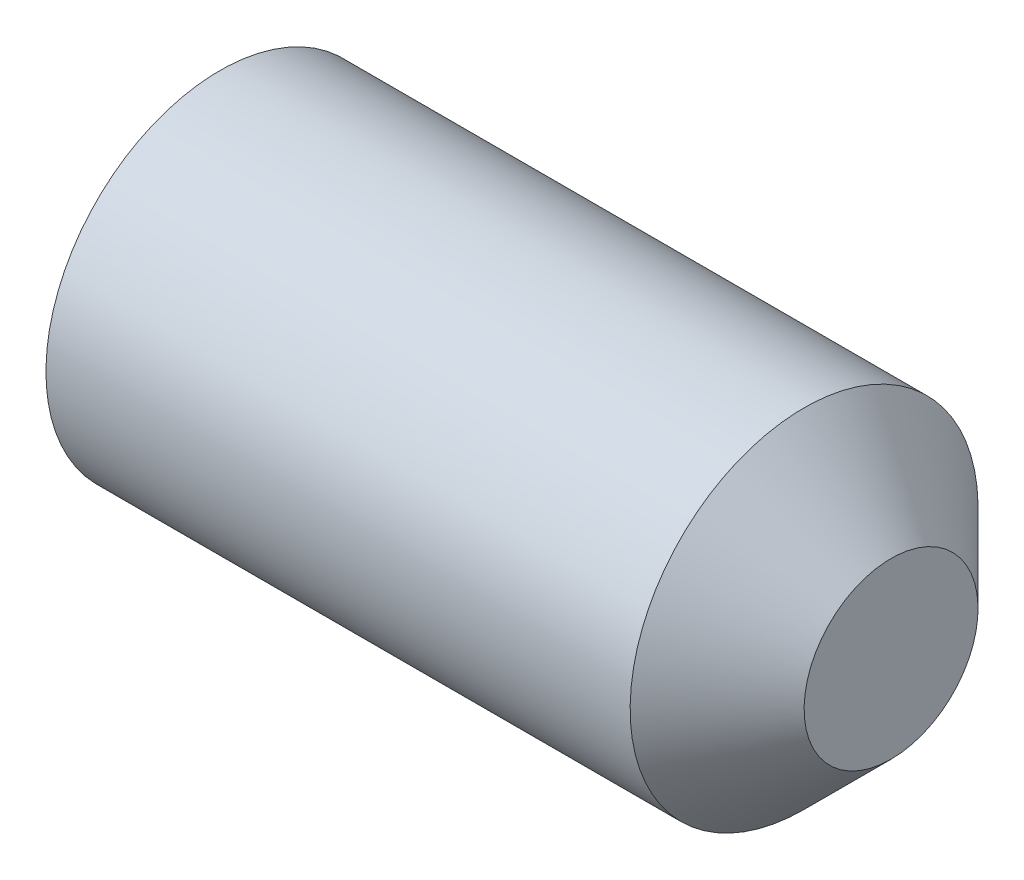
ISO-10303-21;
HEADER;
FILE_DESCRIPTION(('STEP AP214'),'2;1');
FILE_NAME('part.step','',(''),(''),'','','');
FILE_SCHEMA(('AUTOMOTIVE_DESIGN { 1 0 10303 214 1 1 1 1 }'));
ENDSEC;
DATA;
#1=APPLICATION_CONTEXT('core data for automotive mechanical design processes');
#2=APPLICATION_PROTOCOL_DEFINITION('international standard','automotive_design',2000,#1);
#3=PRODUCT_CONTEXT('',#1,'mechanical');
#4=PRODUCT('Part','Part','',(#3));
#5=PRODUCT_RELATED_PRODUCT_CATEGORY('part','',(#4));
#6=PRODUCT_DEFINITION_FORMATION('','',#4);
#7=PRODUCT_DEFINITION_CONTEXT('part definition',#1,'design');
#8=PRODUCT_DEFINITION('design','',#6,#7);
#9=PRODUCT_DEFINITION_SHAPE('','',#8);
#10=(LENGTH_UNIT() NAMED_UNIT(*) SI_UNIT(.MILLI.,.METRE.));
#11=(NAMED_UNIT(*) PLANE_ANGLE_UNIT() SI_UNIT($,.RADIAN.));
#12=(NAMED_UNIT(*) SI_UNIT($,.STERADIAN.) SOLID_ANGLE_UNIT());
#13=UNCERTAINTY_MEASURE_WITH_UNIT(LENGTH_MEASURE(1.E-05),#10,'distance_accuracy_value','');
#14=(GEOMETRIC_REPRESENTATION_CONTEXT(3) GLOBAL_UNCERTAINTY_ASSIGNED_CONTEXT((#13)) GLOBAL_UNIT_ASSIGNED_CONTEXT((#10,
#11,#12)) REPRESENTATION_CONTEXT('',''));
#15=CARTESIAN_POINT('',(0.,0.,0.));
#16=DIRECTION('',(0.,0.,1.));
#17=DIRECTION('',(1.,0.,0.));
#18=AXIS2_PLACEMENT_3D('',#15,#16,#17);
#19=CARTESIAN_POINT('',(0.3,0.,0.));
#20=DIRECTION('',(-1.,0.,0.));
#21=DIRECTION('',(0.,-1.,0.));
#22=AXIS2_PLACEMENT_3D('',#19,#20,#21);
#23=CONICAL_SURFACE('',#22,0.,1.04719755119659);
#24=CARTESIAN_POINT('',(0.,0.,0.));
#25=DIRECTION('',(-1.,0.,0.));
#26=DIRECTION('',(0.,-1.,0.));
#27=AXIS2_PLACEMENT_3D('',#24,#25,#26);
#28=CIRCLE('',#27,0.51961524227066);
#29=CARTESIAN_POINT('',(0.,0.,0.51961524227066));
#30=VERTEX_POINT('',#29);
#31=CARTESIAN_POINT('',(0.,0.45,0.259807621135324));
#32=VERTEX_POINT('',#31);
#33=EDGE_CURVE('E135',#30,#32,#28,.T.);
#34=ORIENTED_EDGE('',*,*,#33,.T.);
#35=CARTESIAN_POINT('',(-6.66888839525152E-05,0.4502,0.259692151081492));
#36=CARTESIAN_POINT('',(0.00653172705960724,0.430421483954661,0.27111128264444));
#37=CARTESIAN_POINT('',(0.0125342691634511,0.410472798158753,0.282628661758686));
#38=CARTESIAN_POINT('',(0.0230135187971852,0.370229751521738,0.305862995567578));
#39=CARTESIAN_POINT('',(0.027486516452898,0.349934673828958,0.317580364136728));
#40=CARTESIAN_POINT('',(0.034450129571118,0.309595036889726,0.340870464382606));
#41=CARTESIAN_POINT('',(0.036987101516643,0.289556723246236,0.352439590158781));
#42=CARTESIAN_POINT('',(0.040025127002509,0.249389705984048,0.375630028387649));
#43=CARTESIAN_POINT('',(0.0405286808946072,0.229261143861694,0.38725125914739));
#44=CARTESIAN_POINT('',(0.0390166754817044,0.174083098641577,0.419108318408582));
#45=CARTESIAN_POINT('',(0.0348502997742021,0.139064505017148,0.439326312864288));
#46=CARTESIAN_POINT('',(0.0245754670606726,0.0867922566681631,0.469505709519721));
#47=CARTESIAN_POINT('',(0.0204087890255679,0.069213824417743,0.479654622111433));
#48=CARTESIAN_POINT('',(0.0109518938247607,0.0343196791997078,0.499800766246207));
#49=CARTESIAN_POINT('',(0.00566390792624987,0.0170035166025984,0.50979825738298));
#50=CARTESIAN_POINT('',(-6.66888839509336E-05,-0.000200000000000022,0.519730712324498));
#51=B_SPLINE_CURVE_WITH_KNOTS('',3,(#35,#36,#37,#38,#39,#40,#41,#42,#43,#44,#45,#46,#47,#48,#49,
#50),.UNSPECIFIED.,.F.,.F.,(4,2,2,2,2,2,2,4),(0.,0.0713444195912559,0.142860675962759,
0.212605584457696,0.282264706361124,0.403704621565636,0.465844557315113,0.527861983379931),.UNSPECIFIED.);
#52=EDGE_CURVE('E11',#32,#30,#51,.T.);
#53=ORIENTED_EDGE('',*,*,#52,.T.);
#54=EDGE_LOOP('',(#34,#53));
#55=FACE_BOUND('',#54,.T.);
#56=ADVANCED_FACE('F33',(#55),#23,.F.);
#57=CARTESIAN_POINT('',(0.,-0.45,0.25980762113533));
#58=VERTEX_POINT('',#57);
#59=EDGE_CURVE('E131',#58,#30,#28,.T.);
#60=ORIENTED_EDGE('',*,*,#59,.T.);
#61=CARTESIAN_POINT('',(-6.66888839509963E-05,0.000199999999999954,0.519730712324498));
#62=CARTESIAN_POINT('',(0.00653172705960863,-0.0195785160453388,0.50831158076155));
#63=CARTESIAN_POINT('',(0.0125342691634524,-0.0395272018412467,0.496794201647304));
#64=CARTESIAN_POINT('',(0.0230135187971862,-0.0797702484782621,0.473559867838412));
#65=CARTESIAN_POINT('',(0.0274865164528988,-0.100065326171041,0.461842499269262));
#66=CARTESIAN_POINT('',(0.0344501295711185,-0.140404963110274,0.438552399023384));
#67=CARTESIAN_POINT('',(0.0369871015166435,-0.160443276753764,0.426983273247209));
#68=CARTESIAN_POINT('',(0.0400251270025092,-0.200610294015951,0.403792835018341));
#69=CARTESIAN_POINT('',(0.0405286808946073,-0.220738856138306,0.3921716042586));
#70=CARTESIAN_POINT('',(0.0390166754817042,-0.275916901358422,0.360314544997408));
#71=CARTESIAN_POINT('',(0.0348502997742015,-0.310935494982852,0.340096550541702));
#72=CARTESIAN_POINT('',(0.0245754670606718,-0.363207743331836,0.309917153886269));
#73=CARTESIAN_POINT('',(0.0204087890255671,-0.380786175582257,0.299768241294557));
#74=CARTESIAN_POINT('',(0.0109518938247597,-0.415680320800292,0.279622097159783));
#75=CARTESIAN_POINT('',(0.00566390792624876,-0.432996483397401,0.26962460602301));
#76=CARTESIAN_POINT('',(-6.66888839522213E-05,-0.4502,0.259692151081492));
#77=B_SPLINE_CURVE_WITH_KNOTS('',3,(#61,#62,#63,#64,#65,#66,#67,#68,#69,#70,#71,#72,#73,#74,#75,
#76),.UNSPECIFIED.,.F.,.F.,(4,2,2,2,2,2,2,4),(0.,0.0713444195912556,0.142860675962758,
0.212605584457695,0.282264706361123,0.403704621565635,0.465844557315112,0.527861983379931),.UNSPECIFIED.);
#78=EDGE_CURVE('E46',#30,#58,#77,.T.);
#79=ORIENTED_EDGE('',*,*,#78,.T.);
#80=EDGE_LOOP('',(#60,#79));
#81=FACE_BOUND('',#80,.T.);
#82=ADVANCED_FACE('F201',(#81),#23,.F.);
#83=CARTESIAN_POINT('',(0.,-0.45,-0.25980762113533));
#84=VERTEX_POINT('',#83);
#85=EDGE_CURVE('E130',#84,#58,#28,.T.);
#86=ORIENTED_EDGE('',*,*,#85,.T.);
#87=CARTESIAN_POINT('',(-0.167325879932759,-0.45,-0.672815304645171));
#88=CARTESIAN_POINT('',(-0.158001759178348,-0.45,-0.653382567146488));
#89=CARTESIAN_POINT('',(-0.148776152203629,-0.45,-0.633902770072334));
#90=CARTESIAN_POINT('',(-0.130573544393024,-0.45,-0.594823264113635));
#91=CARTESIAN_POINT('',(-0.121596588297758,-0.45,-0.5752235344139));
#92=CARTESIAN_POINT('',(-0.0950153183469655,-0.45,-0.515980526481325));
#93=CARTESIAN_POINT('',(-0.0778736353237743,-0.45,-0.47612575486808));
#94=CARTESIAN_POINT('',(-0.0451106178559764,-0.45,-0.3945748475684));
#95=CARTESIAN_POINT('',(-0.0295406271142098,-0.45,-0.352857800316648));
#96=CARTESIAN_POINT('',(-0.00183306277081833,-0.45,-0.268349284360111));
#97=CARTESIAN_POINT('',(0.0103134219915786,-0.45,-0.225560926692814));
#98=CARTESIAN_POINT('',(0.0244009034813655,-0.45,-0.160514993917704));
#99=CARTESIAN_POINT('',(0.028406205648938,-0.45,-0.138709873455419));
#100=CARTESIAN_POINT('',(0.0347659057008732,-0.45,-0.0948549918774094));
#101=CARTESIAN_POINT('',(0.0371204151496414,-0.45,-0.0728052473962739));
#102=CARTESIAN_POINT('',(0.039960458555727,-0.45,-0.0288477221469544));
#103=CARTESIAN_POINT('',(0.0404680477479484,-0.45,-0.00694140584462085));
#104=CARTESIAN_POINT('',(0.0396301597624702,-0.45,0.0368349103264743));
#105=CARTESIAN_POINT('',(0.0382845678406222,-0.45,0.0587049078625245));
#106=CARTESIAN_POINT('',(0.0327967553536856,-0.45,0.112666314227676));
#107=CARTESIAN_POINT('',(0.027626148000219,-0.45,0.144653361443957));
#108=CARTESIAN_POINT('',(0.0142918581073101,-0.45,0.208003062927822));
#109=CARTESIAN_POINT('',(0.00612456819211948,-0.45,0.239364916419214));
#110=CARTESIAN_POINT('',(-0.0125413731327451,-0.45,0.302137073282898));
#111=CARTESIAN_POINT('',(-0.0230882230070336,-0.45,0.333532674691125));
#112=CARTESIAN_POINT('',(-0.0457040201416149,-0.45,0.395747240948126));
#113=CARTESIAN_POINT('',(-0.0577724331004678,-0.45,0.426566403873595));
#114=CARTESIAN_POINT('',(-0.090024526173721,-0.45,0.504965985572437));
#115=CARTESIAN_POINT('',(-0.110958081103708,-0.45,0.552234907386845));
#116=CARTESIAN_POINT('',(-0.154295866522787,-0.45,0.646094421082346));
#117=CARTESIAN_POINT('',(-0.176700474276702,-0.45,0.692684835181449));
#118=CARTESIAN_POINT('',(-0.222453425540136,-0.45,0.785464529819758));
#119=CARTESIAN_POINT('',(-0.24580282094626,-0.45,0.831653289585937));
#120=CARTESIAN_POINT('',(-0.293105854507297,-0.45,0.923721004656836));
#121=CARTESIAN_POINT('',(-0.317059517094918,-0.45,0.969599947339142));
#122=CARTESIAN_POINT('',(-0.38496905023855,-0.45,1.09826702015621));
#123=CARTESIAN_POINT('',(-0.429390030359738,-0.45,1.1808092680611));
#124=CARTESIAN_POINT('',(-0.496513992041545,-0.45,1.30421778525283));
#125=CARTESIAN_POINT('',(-0.518942048017681,-0.45,1.34523485292903));
#126=CARTESIAN_POINT('',(-0.563944137236346,-0.45,1.42718606343186));
#127=CARTESIAN_POINT('',(-0.586518162777899,-0.45,1.46812021048593));
#128=CARTESIAN_POINT('',(-0.609148310462413,-0.45,1.50902350917736));
#129=B_SPLINE_CURVE_WITH_KNOTS('',3,(#87,#88,#89,#90,#91,#92,#93,#94,#95,#96,#97,#98,#99,#100,
#101,#102,#103,#104,#105,#106,#107,#108,#109,#110,#111,#112,#113,#114,#115,#116,#117,#118,#119,
#120,#121,#122,#123,#124,#125,#126,#127,#128),.UNSPECIFIED.,.F.,.F.,(4,2,2,2,2,2,2,2,2,2,2,2,2,
2,2,2,2,2,2,2,4),(0.,0.0646606550585354,0.129332870134679,0.259452154750926,0.392966772480849,
0.526130581502781,0.592588524703461,0.659041976088961,0.724699211420468,0.790360512259777,
0.887366396654076,0.984489440925591,1.08379169798611,1.18305918137843,1.33809985745054,
1.49318045160005,1.64843873331219,1.80370330277247,2.08490270829397,2.22514805598809,
2.36538606410607),.UNSPECIFIED.);
#130=EDGE_CURVE('E177',#58,#84,#129,.F.);
#131=ORIENTED_EDGE('',*,*,#130,.T.);
#132=EDGE_LOOP('',(#86,#131));
#133=FACE_BOUND('',#132,.T.);
#134=ADVANCED_FACE('F207',(#133),#23,.F.);
#135=CARTESIAN_POINT('',(0.,0.,-0.51961524227066));
#136=VERTEX_POINT('',#135);
#137=EDGE_CURVE('E229',#136,#84,#28,.T.);
#138=ORIENTED_EDGE('',*,*,#137,.T.);
#139=CARTESIAN_POINT('',(-6.66888839523028E-05,-0.4502,-0.259692151081492));
#140=CARTESIAN_POINT('',(0.00653172705960735,-0.430421483954661,-0.27111128264444));
#141=CARTESIAN_POINT('',(0.0125342691634512,-0.410472798158753,-0.282628661758686));
#142=CARTESIAN_POINT('',(0.0230135187971853,-0.370229751521738,-0.305862995567578));
#143=CARTESIAN_POINT('',(0.0274865164528981,-0.349934673828958,-0.317580364136728));
#144=CARTESIAN_POINT('',(0.0344501295711181,-0.309595036889726,-0.340870464382606));
#145=CARTESIAN_POINT('',(0.0369871015166431,-0.289556723246236,-0.352439590158781));
#146=CARTESIAN_POINT('',(0.0400251270025091,-0.249389705984048,-0.375630028387649));
#147=CARTESIAN_POINT('',(0.0405286808946073,-0.229261143861694,-0.38725125914739));
#148=CARTESIAN_POINT('',(0.0390166754817045,-0.174083098641577,-0.419108318408582));
#149=CARTESIAN_POINT('',(0.0348502997742021,-0.139064505017148,-0.439326312864288));
#150=CARTESIAN_POINT('',(0.0245754670606726,-0.0867922566681631,-0.469505709519721));
#151=CARTESIAN_POINT('',(0.0204087890255679,-0.069213824417743,-0.479654622111433));
#152=CARTESIAN_POINT('',(0.0109518938247607,-0.0343196791997078,-0.499800766246207));
#153=CARTESIAN_POINT('',(0.00566390792624982,-0.0170035166025983,-0.50979825738298));
#154=CARTESIAN_POINT('',(-6.66888839509676E-05,0.000200000000000026,-0.519730712324498));
#155=B_SPLINE_CURVE_WITH_KNOTS('',3,(#139,#140,#141,#142,#143,#144,#145,#146,#147,#148,#149,
#150,#151,#152,#153,#154),.UNSPECIFIED.,.F.,.F.,(4,2,2,2,2,2,2,4),(0.,0.0713444195912559,
0.142860675962759,0.212605584457696,0.282264706361124,0.403704621565636,0.465844557315113,
0.527861983379931),.UNSPECIFIED.);
#156=EDGE_CURVE('E172',#84,#136,#155,.T.);
#157=ORIENTED_EDGE('',*,*,#156,.T.);
#158=EDGE_LOOP('',(#138,#157));
#159=FACE_BOUND('',#158,.T.);
#160=ADVANCED_FACE('F219',(#159),#23,.F.);
#161=CARTESIAN_POINT('',(0.,0.45,-0.25980762113533));
#162=VERTEX_POINT('',#161);
#163=EDGE_CURVE('E227',#162,#136,#28,.T.);
#164=ORIENTED_EDGE('',*,*,#163,.T.);
#165=CARTESIAN_POINT('',(-6.66888839509963E-05,-0.000199999999999954,-0.519730712324498));
#166=CARTESIAN_POINT('',(0.00653172705960863,0.0195785160453388,-0.50831158076155));
#167=CARTESIAN_POINT('',(0.0125342691634524,0.0395272018412467,-0.496794201647304));
#168=CARTESIAN_POINT('',(0.0230135187971861,0.0797702484782621,-0.473559867838412));
#169=CARTESIAN_POINT('',(0.0274865164528987,0.100065326171041,-0.461842499269262));
#170=CARTESIAN_POINT('',(0.0344501295711185,0.140404963110274,-0.438552399023384));
#171=CARTESIAN_POINT('',(0.0369871015166435,0.160443276753764,-0.426983273247209));
#172=CARTESIAN_POINT('',(0.0400251270025092,0.200610294015951,-0.403792835018341));
#173=CARTESIAN_POINT('',(0.0405286808946072,0.220738856138306,-0.3921716042586));
#174=CARTESIAN_POINT('',(0.0390166754817041,0.275916901358422,-0.360314544997408));
#175=CARTESIAN_POINT('',(0.0348502997742015,0.310935494982852,-0.340096550541702));
#176=CARTESIAN_POINT('',(0.0245754670606717,0.363207743331837,-0.309917153886269));
#177=CARTESIAN_POINT('',(0.0204087890255669,0.380786175582257,-0.299768241294557));
#178=CARTESIAN_POINT('',(0.0109518938247594,0.415680320800292,-0.279622097159783));
#179=CARTESIAN_POINT('',(0.00566390792624846,0.432996483397402,-0.26962460602301));
#180=CARTESIAN_POINT('',(-6.66888839525342E-05,0.4502,-0.259692151081492));
#181=B_SPLINE_CURVE_WITH_KNOTS('',3,(#165,#166,#167,#168,#169,#170,#171,#172,#173,#174,#175,
#176,#177,#178,#179,#180),.UNSPECIFIED.,.F.,.F.,(4,2,2,2,2,2,2,4),(0.,0.0713444195912556,
0.142860675962758,0.212605584457695,0.282264706361123,0.403704621565635,0.465844557315112,
0.527861983379931),.UNSPECIFIED.);
#182=EDGE_CURVE('E113',#136,#162,#181,.T.);
#183=ORIENTED_EDGE('',*,*,#182,.T.);
#184=EDGE_LOOP('',(#164,#183));
#185=FACE_BOUND('',#184,.T.);
#186=ADVANCED_FACE('F211',(#185),#23,.F.);
#187=EDGE_CURVE('E223',#32,#162,#28,.T.);
#188=ORIENTED_EDGE('',*,*,#187,.T.);
#189=CARTESIAN_POINT('',(-0.167325879932759,0.45,-0.672815304645171));
#190=CARTESIAN_POINT('',(-0.158001759178348,0.45,-0.653382567146488));
#191=CARTESIAN_POINT('',(-0.148776152203629,0.45,-0.633902770072334));
#192=CARTESIAN_POINT('',(-0.130573544393024,0.45,-0.594823264113635));
#193=CARTESIAN_POINT('',(-0.121596588297759,0.45,-0.5752235344139));
#194=CARTESIAN_POINT('',(-0.0950153183469655,0.45,-0.515980526481325));
#195=CARTESIAN_POINT('',(-0.0778736353237744,0.45,-0.47612575486808));
#196=CARTESIAN_POINT('',(-0.0451106178559765,0.45,-0.3945748475684));
#197=CARTESIAN_POINT('',(-0.02954062711421,0.45,-0.352857800316648));
#198=CARTESIAN_POINT('',(-0.00183306277081848,0.45,-0.268349284360111));
#199=CARTESIAN_POINT('',(0.0103134219915784,0.45,-0.225560926692814));
#200=CARTESIAN_POINT('',(0.0244009034813654,0.45,-0.160514993917704));
#201=CARTESIAN_POINT('',(0.0284062056489378,0.45,-0.138709873455419));
#202=CARTESIAN_POINT('',(0.0347659057008729,0.45,-0.0948549918774093));
#203=CARTESIAN_POINT('',(0.0371204151496411,0.45,-0.0728052473962737));
#204=CARTESIAN_POINT('',(0.0399604585557268,0.45,-0.0288477221469542));
#205=CARTESIAN_POINT('',(0.0404680477479482,0.45,-0.00694140584462058));
#206=CARTESIAN_POINT('',(0.03963015976247,0.45,0.0368349103264745));
#207=CARTESIAN_POINT('',(0.038284567840622,0.45,0.0587049078625247));
#208=CARTESIAN_POINT('',(0.0327967553536853,0.45,0.112666314227676));
#209=CARTESIAN_POINT('',(0.0276261480002187,0.45,0.144653361443957));
#210=CARTESIAN_POINT('',(0.0142918581073098,0.45,0.208003062927822));
#211=CARTESIAN_POINT('',(0.00612456819211914,0.45,0.239364916419214));
#212=CARTESIAN_POINT('',(-0.0125413731327455,0.45,0.302137073282898));
#213=CARTESIAN_POINT('',(-0.0230882230070341,0.45,0.333532674691125));
#214=CARTESIAN_POINT('',(-0.0457040201416154,0.45,0.395747240948127));
#215=CARTESIAN_POINT('',(-0.0577724331004683,0.45,0.426566403873596));
#216=CARTESIAN_POINT('',(-0.0900245261737215,0.45,0.504965985572438));
#217=CARTESIAN_POINT('',(-0.110958081103708,0.45,0.552234907386846));
#218=CARTESIAN_POINT('',(-0.154295866522787,0.45,0.646094421082347));
#219=CARTESIAN_POINT('',(-0.176700474276702,0.45,0.69268483518145));
#220=CARTESIAN_POINT('',(-0.222453425540137,0.45,0.785464529819759));
#221=CARTESIAN_POINT('',(-0.245802820946261,0.45,0.831653289585939));
#222=CARTESIAN_POINT('',(-0.293105854507297,0.45,0.923721004656837));
#223=CARTESIAN_POINT('',(-0.317059517094919,0.45,0.969599947339143));
#224=CARTESIAN_POINT('',(-0.384969050238551,0.45,1.09826702015621));
#225=CARTESIAN_POINT('',(-0.429390030359739,0.45,1.1808092680611));
#226=CARTESIAN_POINT('',(-0.496513992041546,0.45,1.30421778525283));
#227=CARTESIAN_POINT('',(-0.518942048017682,0.45,1.34523485292903));
#228=CARTESIAN_POINT('',(-0.563944137236347,0.45,1.42718606343186));
#229=CARTESIAN_POINT('',(-0.5865181627779,0.45,1.46812021048593));
#230=CARTESIAN_POINT('',(-0.609148310462414,0.45,1.50902350917736));
#231=B_SPLINE_CURVE_WITH_KNOTS('',3,(#189,#190,#191,#192,#193,#194,#195,#196,#197,#198,#199,
#200,#201,#202,#203,#204,#205,#206,#207,#208,#209,#210,#211,#212,#213,#214,#215,#216,#217,#218,
#219,#220,#221,#222,#223,#224,#225,#226,#227,#228,#229,#230),.UNSPECIFIED.,.F.,.F.,(4,2,2,2,2,2,
2,2,2,2,2,2,2,2,2,2,2,2,2,2,4),(0.,0.0646606550585355,0.129332870134679,0.259452154750926,
0.39296677248085,0.526130581502781,0.592588524703461,0.659041976088961,0.724699211420468,
0.790360512259777,0.887366396654076,0.984489440925592,1.08379169798611,1.18305918137843,
1.33809985745054,1.49318045160005,1.64843873331219,1.80370330277247,2.08490270829397,
2.22514805598809,2.36538606410607),.UNSPECIFIED.);
#232=EDGE_CURVE('E79',#162,#32,#231,.T.);
#233=ORIENTED_EDGE('',*,*,#232,.T.);
#234=EDGE_LOOP('',(#188,#233));
#235=FACE_BOUND('',#234,.T.);
#236=ADVANCED_FACE('F203',(#235),#23,.F.);
#237=CARTESIAN_POINT('',(4.,0.,0.));
#238=DIRECTION('',(1.,0.,0.));
#239=DIRECTION('',(0.,1.,0.));
#240=AXIS2_PLACEMENT_3D('',#237,#238,#239);
#241=PLANE('',#240);
#242=CARTESIAN_POINT('',(4.,0.,0.));
#243=DIRECTION('',(-1.,0.,0.));
#244=DIRECTION('',(0.,-1.,0.));
#245=AXIS2_PLACEMENT_3D('',#242,#243,#244);
#246=CIRCLE('',#245,0.5);
#247=CARTESIAN_POINT('',(4.,-0.5,0.));
#248=VERTEX_POINT('',#247);
#249=EDGE_CURVE('E144',#248,#248,#246,.T.);
#250=ORIENTED_EDGE('',*,*,#249,.F.);
#251=EDGE_LOOP('',(#250));
#252=FACE_BOUND('',#251,.T.);
#253=ADVANCED_FACE('F35',(#252),#241,.T.);
#254=CARTESIAN_POINT('',(3.5,0.,0.));
#255=DIRECTION('',(-1.,0.,0.));
#256=DIRECTION('',(0.,-1.,0.));
#257=AXIS2_PLACEMENT_3D('',#254,#255,#256);
#258=CONICAL_SURFACE('',#257,1.,0.785398163397448);
#259=ORIENTED_EDGE('',*,*,#249,.T.);
#260=EDGE_LOOP('',(#259));
#261=FACE_BOUND('',#260,.T.);
#262=CARTESIAN_POINT('',(3.5,0.,0.));
#263=DIRECTION('',(-1.,0.,0.));
#264=DIRECTION('',(0.,-1.,0.));
#265=AXIS2_PLACEMENT_3D('',#262,#263,#264);
#266=CIRCLE('',#265,1.);
#267=CARTESIAN_POINT('',(3.5,-1.,0.));
#268=VERTEX_POINT('',#267);
#269=EDGE_CURVE('E141',#268,#268,#266,.T.);
#270=ORIENTED_EDGE('',*,*,#269,.F.);
#271=EDGE_LOOP('',(#270));
#272=FACE_BOUND('',#271,.T.);
#273=ADVANCED_FACE('F217',(#261,#272),#258,.T.);
#274=CARTESIAN_POINT('',(0.3,0.,0.));
#275=DIRECTION('',(-1.,0.,0.));
#276=DIRECTION('',(0.,-1.,0.));
#277=AXIS2_PLACEMENT_3D('',#274,#275,#276);
#278=CYLINDRICAL_SURFACE('',#277,1.);
#279=ORIENTED_EDGE('',*,*,#269,.T.);
#280=EDGE_LOOP('',(#279));
#281=FACE_BOUND('',#280,.T.);
#282=CARTESIAN_POINT('',(0.14173949108605,0.,0.));
#283=DIRECTION('',(-1.,0.,0.));
#284=DIRECTION('',(0.,-1.,0.));
#285=AXIS2_PLACEMENT_3D('',#282,#283,#284);
#286=CIRCLE('',#285,1.);
#287=CARTESIAN_POINT('',(0.14173949108605,-1.,0.));
#288=VERTEX_POINT('',#287);
#289=EDGE_CURVE('E138',#288,#288,#286,.T.);
#290=ORIENTED_EDGE('',*,*,#289,.F.);
#291=EDGE_LOOP('',(#290));
#292=FACE_BOUND('',#291,.T.);
#293=ADVANCED_FACE('F326',(#281,#292),#278,.T.);
#294=CARTESIAN_POINT('',(0.,0.,0.));
#295=DIRECTION('',(1.,0.,0.));
#296=DIRECTION('',(0.,1.,0.));
#297=AXIS2_PLACEMENT_3D('',#294,#295,#296);
#298=CONICAL_SURFACE('',#297,0.7545,1.04719755119661);
#299=ORIENTED_EDGE('',*,*,#289,.T.);
#300=EDGE_LOOP('',(#299));
#301=FACE_BOUND('',#300,.T.);
#302=CARTESIAN_POINT('',(0.,0.,0.));
#303=DIRECTION('',(-1.,0.,0.));
#304=DIRECTION('',(0.,-1.,0.));
#305=AXIS2_PLACEMENT_3D('',#302,#303,#304);
#306=CIRCLE('',#305,0.7545);
#307=CARTESIAN_POINT('',(0.,-0.7545,0.));
#308=VERTEX_POINT('',#307);
#309=EDGE_CURVE('E134',#308,#308,#306,.T.);
#310=ORIENTED_EDGE('',*,*,#309,.F.);
#311=EDGE_LOOP('',(#310));
#312=FACE_BOUND('',#311,.T.);
#313=ADVANCED_FACE('F198',(#301,#312),#298,.T.);
#314=CARTESIAN_POINT('',(0.,-0.7545,0.));
#315=DIRECTION('',(-1.,0.,0.));
#316=DIRECTION('',(0.,-1.,0.));
#317=AXIS2_PLACEMENT_3D('',#314,#315,#316);
#318=PLANE('',#317);
#319=ORIENTED_EDGE('',*,*,#309,.T.);
#320=EDGE_LOOP('',(#319));
#321=FACE_BOUND('',#320,.T.);
#322=ORIENTED_EDGE('',*,*,#59,.F.);
#323=ORIENTED_EDGE('',*,*,#85,.F.);
#324=ORIENTED_EDGE('',*,*,#137,.F.);
#325=ORIENTED_EDGE('',*,*,#163,.F.);
#326=ORIENTED_EDGE('',*,*,#187,.F.);
#327=ORIENTED_EDGE('',*,*,#33,.F.);
#328=EDGE_LOOP('',(#322,#323,#324,#325,#326,#327));
#329=FACE_BOUND('',#328,.T.);
#330=ADVANCED_FACE('F193',(#321,#329),#318,.T.);
#331=CARTESIAN_POINT('',(1.7,0.45,0.25980762113533));
#332=DIRECTION('',(0.,-0.499999999999998,-0.86602540378444));
#333=DIRECTION('',(0.,0.86602540378444,-0.499999999999998));
#334=AXIS2_PLACEMENT_3D('',#331,#332,#333);
#335=PLANE('',#334);
#336=DIRECTION('',(-1.,0.,0.));
#337=VECTOR('',#336,1.);
#338=CARTESIAN_POINT('',(1.7,0.45,0.25980762113533));
#339=LINE('',#338,#337);
#340=CARTESIAN_POINT('',(1.7,0.45,0.25980762113533));
#341=VERTEX_POINT('',#340);
#342=EDGE_CURVE('E53',#341,#32,#339,.T.);
#343=ORIENTED_EDGE('',*,*,#342,.F.);
#344=DIRECTION('',(0.,-0.86602540378444,0.499999999999998));
#345=VECTOR('',#344,1.);
#346=CARTESIAN_POINT('',(1.7,0.45,0.25980762113533));
#347=LINE('',#346,#345);
#348=CARTESIAN_POINT('',(1.7,0.,0.51961524227066));
#349=VERTEX_POINT('',#348);
#350=EDGE_CURVE('E239',#341,#349,#347,.T.);
#351=ORIENTED_EDGE('',*,*,#350,.T.);
#352=DIRECTION('',(-1.,0.,0.));
#353=VECTOR('',#352,1.);
#354=CARTESIAN_POINT('',(1.7,0.,0.51961524227066));
#355=LINE('',#354,#353);
#356=EDGE_CURVE('E127',#349,#30,#355,.T.);
#357=ORIENTED_EDGE('',*,*,#356,.T.);
#358=ORIENTED_EDGE('',*,*,#52,.F.);
#359=EDGE_LOOP('',(#343,#351,#357,#358));
#360=FACE_BOUND('',#359,.T.);
#361=ADVANCED_FACE('F189',(#360),#335,.T.);
#362=CARTESIAN_POINT('',(1.7,0.,0.51961524227066));
#363=DIRECTION('',(0.,0.499999999999998,-0.86602540378444));
#364=DIRECTION('',(0.,0.86602540378444,0.499999999999998));
#365=AXIS2_PLACEMENT_3D('',#362,#363,#364);
#366=PLANE('',#365);
#367=ORIENTED_EDGE('',*,*,#356,.F.);
#368=DIRECTION('',(0.,-0.86602540378444,-0.499999999999998));
#369=VECTOR('',#368,1.);
#370=CARTESIAN_POINT('',(1.7,0.,0.51961524227066));
#371=LINE('',#370,#369);
#372=CARTESIAN_POINT('',(1.7,-0.45,0.25980762113533));
#373=VERTEX_POINT('',#372);
#374=EDGE_CURVE('E88',#349,#373,#371,.T.);
#375=ORIENTED_EDGE('',*,*,#374,.T.);
#376=DIRECTION('',(-1.,0.,0.));
#377=VECTOR('',#376,1.);
#378=CARTESIAN_POINT('',(1.7,-0.45,0.25980762113533));
#379=LINE('',#378,#377);
#380=EDGE_CURVE('E124',#373,#58,#379,.T.);
#381=ORIENTED_EDGE('',*,*,#380,.T.);
#382=ORIENTED_EDGE('',*,*,#78,.F.);
#383=EDGE_LOOP('',(#367,#375,#381,#382));
#384=FACE_BOUND('',#383,.T.);
#385=ADVANCED_FACE('F186',(#384),#366,.T.);
#386=CARTESIAN_POINT('',(1.7,-0.45,0.25980762113533));
#387=DIRECTION('',(0.,1.,0.));
#388=DIRECTION('',(0.,0.,1.));
#389=AXIS2_PLACEMENT_3D('',#386,#387,#388);
#390=PLANE('',#389);
#391=ORIENTED_EDGE('',*,*,#380,.F.);
#392=DIRECTION('',(0.,0.,-1.));
#393=VECTOR('',#392,1.);
#394=CARTESIAN_POINT('',(1.7,-0.45,0.25980762113533));
#395=LINE('',#394,#393);
#396=CARTESIAN_POINT('',(1.7,-0.45,-0.25980762113533));
#397=VERTEX_POINT('',#396);
#398=EDGE_CURVE('E108',#373,#397,#395,.T.);
#399=ORIENTED_EDGE('',*,*,#398,.T.);
#400=DIRECTION('',(-1.,0.,0.));
#401=VECTOR('',#400,1.);
#402=CARTESIAN_POINT('',(1.7,-0.45,-0.25980762113533));
#403=LINE('',#402,#401);
#404=EDGE_CURVE('E105',#397,#84,#403,.T.);
#405=ORIENTED_EDGE('',*,*,#404,.T.);
#406=ORIENTED_EDGE('',*,*,#130,.F.);
#407=EDGE_LOOP('',(#391,#399,#405,#406));
#408=FACE_BOUND('',#407,.T.);
#409=ADVANCED_FACE('F169',(#408),#390,.T.);
#410=CARTESIAN_POINT('',(1.7,-0.45,-0.25980762113533));
#411=DIRECTION('',(0.,0.499999999999998,0.86602540378444));
#412=DIRECTION('',(0.,-0.86602540378444,0.499999999999998));
#413=AXIS2_PLACEMENT_3D('',#410,#411,#412);
#414=PLANE('',#413);
#415=ORIENTED_EDGE('',*,*,#404,.F.);
#416=DIRECTION('',(0.,0.86602540378444,-0.499999999999998));
#417=VECTOR('',#416,1.);
#418=CARTESIAN_POINT('',(1.7,-0.45,-0.25980762113533));
#419=LINE('',#418,#417);
#420=CARTESIAN_POINT('',(1.7,0.,-0.51961524227066));
#421=VERTEX_POINT('',#420);
#422=EDGE_CURVE('E99',#397,#421,#419,.T.);
#423=ORIENTED_EDGE('',*,*,#422,.T.);
#424=DIRECTION('',(-1.,0.,0.));
#425=VECTOR('',#424,1.);
#426=CARTESIAN_POINT('',(1.7,0.,-0.51961524227066));
#427=LINE('',#426,#425);
#428=EDGE_CURVE('E102',#421,#136,#427,.T.);
#429=ORIENTED_EDGE('',*,*,#428,.T.);
#430=ORIENTED_EDGE('',*,*,#156,.F.);
#431=EDGE_LOOP('',(#415,#423,#429,#430));
#432=FACE_BOUND('',#431,.T.);
#433=ADVANCED_FACE('F101',(#432),#414,.T.);
#434=CARTESIAN_POINT('',(1.7,0.,-0.51961524227066));
#435=DIRECTION('',(0.,-0.499999999999998,0.86602540378444));
#436=DIRECTION('',(0.,-0.86602540378444,-0.499999999999998));
#437=AXIS2_PLACEMENT_3D('',#434,#435,#436);
#438=PLANE('',#437);
#439=ORIENTED_EDGE('',*,*,#428,.F.);
#440=DIRECTION('',(0.,0.86602540378444,0.499999999999998));
#441=VECTOR('',#440,1.);
#442=CARTESIAN_POINT('',(1.7,0.,-0.51961524227066));
#443=LINE('',#442,#441);
#444=CARTESIAN_POINT('',(1.7,0.45,-0.25980762113533));
#445=VERTEX_POINT('',#444);
#446=EDGE_CURVE('E107',#421,#445,#443,.T.);
#447=ORIENTED_EDGE('',*,*,#446,.T.);
#448=DIRECTION('',(-1.,0.,0.));
#449=VECTOR('',#448,1.);
#450=CARTESIAN_POINT('',(1.7,0.45,-0.25980762113533));
#451=LINE('',#450,#449);
#452=EDGE_CURVE('E114',#445,#162,#451,.T.);
#453=ORIENTED_EDGE('',*,*,#452,.T.);
#454=ORIENTED_EDGE('',*,*,#182,.F.);
#455=EDGE_LOOP('',(#439,#447,#453,#454));
#456=FACE_BOUND('',#455,.T.);
#457=ADVANCED_FACE('F111',(#456),#438,.T.);
#458=CARTESIAN_POINT('',(1.7,0.45,-0.25980762113533));
#459=DIRECTION('',(0.,-1.,0.));
#460=DIRECTION('',(0.,0.,-1.));
#461=AXIS2_PLACEMENT_3D('',#458,#459,#460);
#462=PLANE('',#461);
#463=ORIENTED_EDGE('',*,*,#452,.F.);
#464=DIRECTION('',(0.,0.,1.));
#465=VECTOR('',#464,1.);
#466=CARTESIAN_POINT('',(1.7,0.45,-0.25980762113533));
#467=LINE('',#466,#465);
#468=EDGE_CURVE('E59',#445,#341,#467,.T.);
#469=ORIENTED_EDGE('',*,*,#468,.T.);
#470=ORIENTED_EDGE('',*,*,#342,.T.);
#471=ORIENTED_EDGE('',*,*,#232,.F.);
#472=EDGE_LOOP('',(#463,#469,#470,#471));
#473=FACE_BOUND('',#472,.T.);
#474=ADVANCED_FACE('F159',(#473),#462,.T.);
#475=CARTESIAN_POINT('',(1.7,0.,0.));
#476=DIRECTION('',(1.,0.,0.));
#477=DIRECTION('',(0.,0.,-1.));
#478=AXIS2_PLACEMENT_3D('',#475,#476,#477);
#479=PLANE('',#478);
#480=ORIENTED_EDGE('',*,*,#350,.F.);
#481=ORIENTED_EDGE('',*,*,#468,.F.);
#482=ORIENTED_EDGE('',*,*,#446,.F.);
#483=ORIENTED_EDGE('',*,*,#422,.F.);
#484=ORIENTED_EDGE('',*,*,#398,.F.);
#485=ORIENTED_EDGE('',*,*,#374,.F.);
#486=EDGE_LOOP('',(#480,#481,#482,#483,#484,#485));
#487=FACE_BOUND('',#486,.T.);
#488=ADVANCED_FACE('F116',(#487),#479,.F.);
#489=CLOSED_SHELL('',(#56,#82,#134,#160,#186,#236,#253,#273,#293,#313,#330,#361,#385,#409,#433,
#457,#474,#488));
#490=MANIFOLD_SOLID_BREP('B2',#489);
#491=ADVANCED_BREP_SHAPE_REPRESENTATION('',(#18,#490),#14);
#492=SHAPE_DEFINITION_REPRESENTATION(#9,#491);
ENDSEC;
END-ISO-10303-21;
